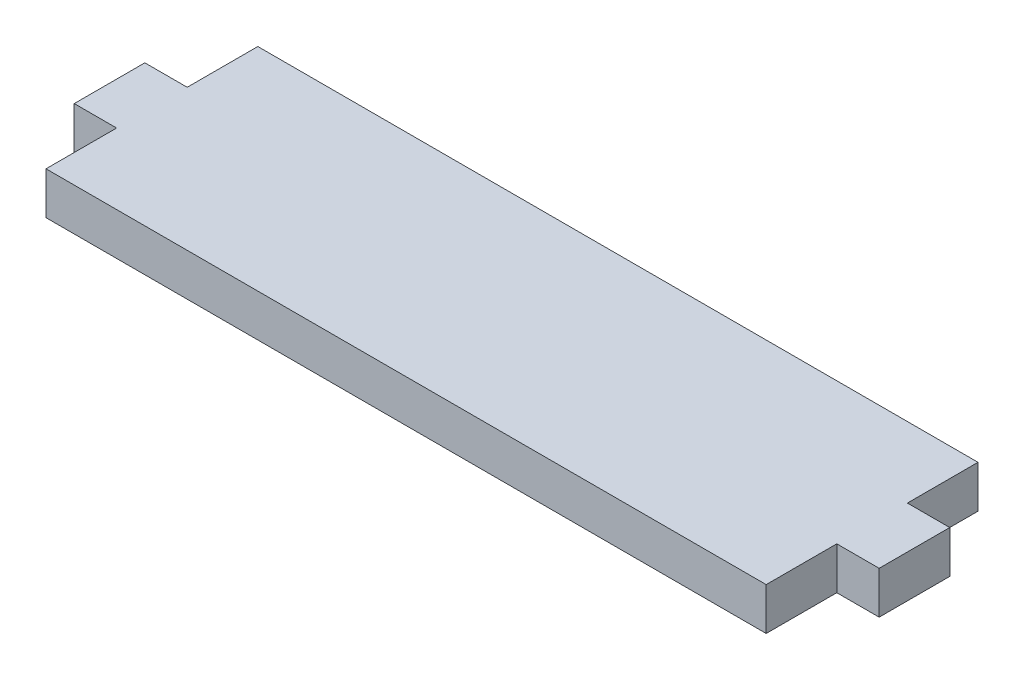
ISO-10303-21;
HEADER;
FILE_DESCRIPTION(('STEP AP214'),'2;1');
FILE_NAME('part.step','',(''),(''),'','','');
FILE_SCHEMA(('AUTOMOTIVE_DESIGN { 1 0 10303 214 1 1 1 1 }'));
ENDSEC;
DATA;
#1=APPLICATION_CONTEXT('core data for automotive mechanical design processes');
#2=APPLICATION_PROTOCOL_DEFINITION('international standard','automotive_design',2000,#1);
#3=PRODUCT_CONTEXT('',#1,'mechanical');
#4=PRODUCT('Part','Part','',(#3));
#5=PRODUCT_RELATED_PRODUCT_CATEGORY('part','',(#4));
#6=PRODUCT_DEFINITION_FORMATION('','',#4);
#7=PRODUCT_DEFINITION_CONTEXT('part definition',#1,'design');
#8=PRODUCT_DEFINITION('design','',#6,#7);
#9=PRODUCT_DEFINITION_SHAPE('','',#8);
#10=(LENGTH_UNIT() NAMED_UNIT(*) SI_UNIT(.MILLI.,.METRE.));
#11=(NAMED_UNIT(*) PLANE_ANGLE_UNIT() SI_UNIT($,.RADIAN.));
#12=(NAMED_UNIT(*) SI_UNIT($,.STERADIAN.) SOLID_ANGLE_UNIT());
#13=UNCERTAINTY_MEASURE_WITH_UNIT(LENGTH_MEASURE(1.E-05),#10,'distance_accuracy_value','');
#14=(GEOMETRIC_REPRESENTATION_CONTEXT(3) GLOBAL_UNCERTAINTY_ASSIGNED_CONTEXT((#13)) GLOBAL_UNIT_ASSIGNED_CONTEXT((#10,
#11,#12)) REPRESENTATION_CONTEXT('',''));
#15=CARTESIAN_POINT('',(0.,0.,0.));
#16=DIRECTION('',(0.,0.,1.));
#17=DIRECTION('',(1.,0.,0.));
#18=AXIS2_PLACEMENT_3D('',#15,#16,#17);
#19=CARTESIAN_POINT('',(-60.,6.,-5.));
#20=DIRECTION('',(1.,0.,0.));
#21=DIRECTION('',(0.,0.,-1.));
#22=AXIS2_PLACEMENT_3D('',#19,#20,#21);
#23=PLANE('',#22);
#24=DIRECTION('',(0.,0.,1.));
#25=VECTOR('',#24,1.);
#26=CARTESIAN_POINT('',(-60.,0.,-5.));
#27=LINE('',#26,#25);
#28=CARTESIAN_POINT('',(-60.,0.,-5.));
#29=VERTEX_POINT('',#28);
#30=CARTESIAN_POINT('',(-60.,0.,5.));
#31=VERTEX_POINT('',#30);
#32=EDGE_CURVE('E155',#29,#31,#27,.T.);
#33=ORIENTED_EDGE('',*,*,#32,.T.);
#34=DIRECTION('',(0.,-1.,0.));
#35=VECTOR('',#34,1.);
#36=CARTESIAN_POINT('',(-60.,6.,5.));
#37=LINE('',#36,#35);
#38=CARTESIAN_POINT('',(-60.,6.,5.));
#39=VERTEX_POINT('',#38);
#40=EDGE_CURVE('E11',#39,#31,#37,.T.);
#41=ORIENTED_EDGE('',*,*,#40,.F.);
#42=DIRECTION('',(0.,0.,1.));
#43=VECTOR('',#42,1.);
#44=CARTESIAN_POINT('',(-60.,6.,-5.));
#45=LINE('',#44,#43);
#46=CARTESIAN_POINT('',(-60.,6.,-5.));
#47=VERTEX_POINT('',#46);
#48=EDGE_CURVE('E177',#47,#39,#45,.T.);
#49=ORIENTED_EDGE('',*,*,#48,.F.);
#50=DIRECTION('',(0.,-1.,0.));
#51=VECTOR('',#50,1.);
#52=CARTESIAN_POINT('',(-60.,6.,-5.));
#53=LINE('',#52,#51);
#54=EDGE_CURVE('E151',#47,#29,#53,.T.);
#55=ORIENTED_EDGE('',*,*,#54,.T.);
#56=EDGE_LOOP('',(#33,#41,#49,#55));
#57=FACE_BOUND('',#56,.T.);
#58=ADVANCED_FACE('F35',(#57),#23,.F.);
#59=CARTESIAN_POINT('',(-60.,6.,5.));
#60=DIRECTION('',(0.,0.,-1.));
#61=DIRECTION('',(-1.,0.,0.));
#62=AXIS2_PLACEMENT_3D('',#59,#60,#61);
#63=PLANE('',#62);
#64=DIRECTION('',(1.,0.,0.));
#65=VECTOR('',#64,1.);
#66=CARTESIAN_POINT('',(-60.,0.,5.));
#67=LINE('',#66,#65);
#68=CARTESIAN_POINT('',(-54.,0.,5.));
#69=VERTEX_POINT('',#68);
#70=EDGE_CURVE('E158',#31,#69,#67,.T.);
#71=ORIENTED_EDGE('',*,*,#70,.T.);
#72=DIRECTION('',(0.,-1.,0.));
#73=VECTOR('',#72,1.);
#74=CARTESIAN_POINT('',(-54.,6.,5.));
#75=LINE('',#74,#73);
#76=CARTESIAN_POINT('',(-54.,6.,5.));
#77=VERTEX_POINT('',#76);
#78=EDGE_CURVE('E43',#77,#69,#75,.T.);
#79=ORIENTED_EDGE('',*,*,#78,.F.);
#80=DIRECTION('',(1.,0.,0.));
#81=VECTOR('',#80,1.);
#82=CARTESIAN_POINT('',(-60.,6.,5.));
#83=LINE('',#82,#81);
#84=EDGE_CURVE('E106',#39,#77,#83,.T.);
#85=ORIENTED_EDGE('',*,*,#84,.F.);
#86=ORIENTED_EDGE('',*,*,#40,.T.);
#87=EDGE_LOOP('',(#71,#79,#85,#86));
#88=FACE_BOUND('',#87,.T.);
#89=ADVANCED_FACE('F255',(#88),#63,.F.);
#90=CARTESIAN_POINT('',(-54.,6.,5.));
#91=DIRECTION('',(1.,0.,0.));
#92=DIRECTION('',(0.,0.,-1.));
#93=AXIS2_PLACEMENT_3D('',#90,#91,#92);
#94=PLANE('',#93);
#95=DIRECTION('',(0.,0.,1.));
#96=VECTOR('',#95,1.);
#97=CARTESIAN_POINT('',(-54.,0.,5.));
#98=LINE('',#97,#96);
#99=CARTESIAN_POINT('',(-54.,0.,15.));
#100=VERTEX_POINT('',#99);
#101=EDGE_CURVE('E160',#69,#100,#98,.T.);
#102=ORIENTED_EDGE('',*,*,#101,.T.);
#103=DIRECTION('',(0.,-1.,0.));
#104=VECTOR('',#103,1.);
#105=CARTESIAN_POINT('',(-54.,6.,15.));
#106=LINE('',#105,#104);
#107=CARTESIAN_POINT('',(-54.,6.,15.));
#108=VERTEX_POINT('',#107);
#109=EDGE_CURVE('E196',#108,#100,#106,.T.);
#110=ORIENTED_EDGE('',*,*,#109,.F.);
#111=DIRECTION('',(0.,0.,1.));
#112=VECTOR('',#111,1.);
#113=CARTESIAN_POINT('',(-54.,6.,5.));
#114=LINE('',#113,#112);
#115=EDGE_CURVE('E204',#77,#108,#114,.T.);
#116=ORIENTED_EDGE('',*,*,#115,.F.);
#117=ORIENTED_EDGE('',*,*,#78,.T.);
#118=EDGE_LOOP('',(#102,#110,#116,#117));
#119=FACE_BOUND('',#118,.T.);
#120=ADVANCED_FACE('F202',(#119),#94,.F.);
#121=CARTESIAN_POINT('',(-54.,6.,15.));
#122=DIRECTION('',(0.,0.,-1.));
#123=DIRECTION('',(-1.,0.,0.));
#124=AXIS2_PLACEMENT_3D('',#121,#122,#123);
#125=PLANE('',#124);
#126=DIRECTION('',(1.,0.,0.));
#127=VECTOR('',#126,1.);
#128=CARTESIAN_POINT('',(-54.,0.,15.));
#129=LINE('',#128,#127);
#130=CARTESIAN_POINT('',(48.,0.,15.));
#131=VERTEX_POINT('',#130);
#132=EDGE_CURVE('E162',#100,#131,#129,.T.);
#133=ORIENTED_EDGE('',*,*,#132,.T.);
#134=DIRECTION('',(0.,-1.,0.));
#135=VECTOR('',#134,1.);
#136=CARTESIAN_POINT('',(48.,6.,15.));
#137=LINE('',#136,#135);
#138=CARTESIAN_POINT('',(48.,6.,15.));
#139=VERTEX_POINT('',#138);
#140=EDGE_CURVE('E193',#139,#131,#137,.T.);
#141=ORIENTED_EDGE('',*,*,#140,.F.);
#142=DIRECTION('',(1.,0.,0.));
#143=VECTOR('',#142,1.);
#144=CARTESIAN_POINT('',(-54.,6.,15.));
#145=LINE('',#144,#143);
#146=EDGE_CURVE('E222',#108,#139,#145,.T.);
#147=ORIENTED_EDGE('',*,*,#146,.F.);
#148=ORIENTED_EDGE('',*,*,#109,.T.);
#149=EDGE_LOOP('',(#133,#141,#147,#148));
#150=FACE_BOUND('',#149,.T.);
#151=ADVANCED_FACE('F213',(#150),#125,.F.);
#152=CARTESIAN_POINT('',(48.,6.,5.));
#153=DIRECTION('',(-1.,0.,0.));
#154=DIRECTION('',(0.,0.,1.));
#155=AXIS2_PLACEMENT_3D('',#152,#153,#154);
#156=PLANE('',#155);
#157=DIRECTION('',(0.,0.,-1.));
#158=VECTOR('',#157,1.);
#159=CARTESIAN_POINT('',(48.,0.,5.));
#160=LINE('',#159,#158);
#161=CARTESIAN_POINT('',(48.,0.,5.));
#162=VERTEX_POINT('',#161);
#163=EDGE_CURVE('E164',#131,#162,#160,.T.);
#164=ORIENTED_EDGE('',*,*,#163,.T.);
#165=DIRECTION('',(0.,-1.,0.));
#166=VECTOR('',#165,1.);
#167=CARTESIAN_POINT('',(48.,6.,5.));
#168=LINE('',#167,#166);
#169=CARTESIAN_POINT('',(48.,6.,5.));
#170=VERTEX_POINT('',#169);
#171=EDGE_CURVE('E190',#170,#162,#168,.T.);
#172=ORIENTED_EDGE('',*,*,#171,.F.);
#173=DIRECTION('',(0.,0.,-1.));
#174=VECTOR('',#173,1.);
#175=CARTESIAN_POINT('',(48.,6.,5.));
#176=LINE('',#175,#174);
#177=EDGE_CURVE('E219',#139,#170,#176,.T.);
#178=ORIENTED_EDGE('',*,*,#177,.F.);
#179=ORIENTED_EDGE('',*,*,#140,.T.);
#180=EDGE_LOOP('',(#164,#172,#178,#179));
#181=FACE_BOUND('',#180,.T.);
#182=ADVANCED_FACE('F217',(#181),#156,.F.);
#183=CARTESIAN_POINT('',(54.,6.,5.));
#184=DIRECTION('',(0.,0.,-1.));
#185=DIRECTION('',(-1.,0.,0.));
#186=AXIS2_PLACEMENT_3D('',#183,#184,#185);
#187=PLANE('',#186);
#188=DIRECTION('',(1.,0.,0.));
#189=VECTOR('',#188,1.);
#190=CARTESIAN_POINT('',(54.,0.,5.));
#191=LINE('',#190,#189);
#192=CARTESIAN_POINT('',(54.,0.,5.));
#193=VERTEX_POINT('',#192);
#194=EDGE_CURVE('E166',#162,#193,#191,.T.);
#195=ORIENTED_EDGE('',*,*,#194,.T.);
#196=DIRECTION('',(0.,-1.,0.));
#197=VECTOR('',#196,1.);
#198=CARTESIAN_POINT('',(54.,6.,5.));
#199=LINE('',#198,#197);
#200=CARTESIAN_POINT('',(54.,6.,5.));
#201=VERTEX_POINT('',#200);
#202=EDGE_CURVE('E187',#201,#193,#199,.T.);
#203=ORIENTED_EDGE('',*,*,#202,.F.);
#204=DIRECTION('',(1.,0.,0.));
#205=VECTOR('',#204,1.);
#206=CARTESIAN_POINT('',(54.,6.,5.));
#207=LINE('',#206,#205);
#208=EDGE_CURVE('E221',#170,#201,#207,.T.);
#209=ORIENTED_EDGE('',*,*,#208,.F.);
#210=ORIENTED_EDGE('',*,*,#171,.T.);
#211=EDGE_LOOP('',(#195,#203,#209,#210));
#212=FACE_BOUND('',#211,.T.);
#213=ADVANCED_FACE('F268',(#212),#187,.F.);
#214=CARTESIAN_POINT('',(54.,6.,-5.));
#215=DIRECTION('',(-1.,0.,0.));
#216=DIRECTION('',(0.,0.,1.));
#217=AXIS2_PLACEMENT_3D('',#214,#215,#216);
#218=PLANE('',#217);
#219=DIRECTION('',(0.,0.,-1.));
#220=VECTOR('',#219,1.);
#221=CARTESIAN_POINT('',(54.,0.,-5.));
#222=LINE('',#221,#220);
#223=CARTESIAN_POINT('',(54.,0.,-5.));
#224=VERTEX_POINT('',#223);
#225=EDGE_CURVE('E168',#193,#224,#222,.T.);
#226=ORIENTED_EDGE('',*,*,#225,.T.);
#227=DIRECTION('',(0.,-1.,0.));
#228=VECTOR('',#227,1.);
#229=CARTESIAN_POINT('',(54.,6.,-5.));
#230=LINE('',#229,#228);
#231=CARTESIAN_POINT('',(54.,6.,-5.));
#232=VERTEX_POINT('',#231);
#233=EDGE_CURVE('E184',#232,#224,#230,.T.);
#234=ORIENTED_EDGE('',*,*,#233,.F.);
#235=DIRECTION('',(0.,0.,-1.));
#236=VECTOR('',#235,1.);
#237=CARTESIAN_POINT('',(54.,6.,-5.));
#238=LINE('',#237,#236);
#239=EDGE_CURVE('E224',#201,#232,#238,.T.);
#240=ORIENTED_EDGE('',*,*,#239,.F.);
#241=ORIENTED_EDGE('',*,*,#202,.T.);
#242=EDGE_LOOP('',(#226,#234,#240,#241));
#243=FACE_BOUND('',#242,.T.);
#244=ADVANCED_FACE('F271',(#243),#218,.F.);
#245=CARTESIAN_POINT('',(54.,6.,-5.));
#246=DIRECTION('',(0.,0.,1.));
#247=DIRECTION('',(1.,0.,0.));
#248=AXIS2_PLACEMENT_3D('',#245,#246,#247);
#249=PLANE('',#248);
#250=DIRECTION('',(-1.,0.,0.));
#251=VECTOR('',#250,1.);
#252=CARTESIAN_POINT('',(54.,0.,-5.));
#253=LINE('',#252,#251);
#254=CARTESIAN_POINT('',(48.,0.,-5.));
#255=VERTEX_POINT('',#254);
#256=EDGE_CURVE('E170',#224,#255,#253,.T.);
#257=ORIENTED_EDGE('',*,*,#256,.T.);
#258=DIRECTION('',(0.,-1.,0.));
#259=VECTOR('',#258,1.);
#260=CARTESIAN_POINT('',(48.,6.,-5.));
#261=LINE('',#260,#259);
#262=CARTESIAN_POINT('',(48.,6.,-5.));
#263=VERTEX_POINT('',#262);
#264=EDGE_CURVE('E181',#263,#255,#261,.T.);
#265=ORIENTED_EDGE('',*,*,#264,.F.);
#266=DIRECTION('',(-1.,0.,0.));
#267=VECTOR('',#266,1.);
#268=CARTESIAN_POINT('',(54.,6.,-5.));
#269=LINE('',#268,#267);
#270=EDGE_CURVE('E230',#232,#263,#269,.T.);
#271=ORIENTED_EDGE('',*,*,#270,.F.);
#272=ORIENTED_EDGE('',*,*,#233,.T.);
#273=EDGE_LOOP('',(#257,#265,#271,#272));
#274=FACE_BOUND('',#273,.T.);
#275=ADVANCED_FACE('F236',(#274),#249,.F.);
#276=CARTESIAN_POINT('',(48.,6.,-5.));
#277=DIRECTION('',(-1.,0.,0.));
#278=DIRECTION('',(0.,0.,1.));
#279=AXIS2_PLACEMENT_3D('',#276,#277,#278);
#280=PLANE('',#279);
#281=DIRECTION('',(0.,0.,-1.));
#282=VECTOR('',#281,1.);
#283=CARTESIAN_POINT('',(48.,0.,-5.));
#284=LINE('',#283,#282);
#285=CARTESIAN_POINT('',(48.,0.,-15.));
#286=VERTEX_POINT('',#285);
#287=EDGE_CURVE('E172',#255,#286,#284,.T.);
#288=ORIENTED_EDGE('',*,*,#287,.T.);
#289=DIRECTION('',(0.,-1.,0.));
#290=VECTOR('',#289,1.);
#291=CARTESIAN_POINT('',(48.,6.,-15.));
#292=LINE('',#291,#290);
#293=CARTESIAN_POINT('',(48.,6.,-15.));
#294=VERTEX_POINT('',#293);
#295=EDGE_CURVE('E146',#294,#286,#292,.T.);
#296=ORIENTED_EDGE('',*,*,#295,.F.);
#297=DIRECTION('',(0.,0.,-1.));
#298=VECTOR('',#297,1.);
#299=CARTESIAN_POINT('',(48.,6.,-5.));
#300=LINE('',#299,#298);
#301=EDGE_CURVE('E137',#263,#294,#300,.T.);
#302=ORIENTED_EDGE('',*,*,#301,.F.);
#303=ORIENTED_EDGE('',*,*,#264,.T.);
#304=EDGE_LOOP('',(#288,#296,#302,#303));
#305=FACE_BOUND('',#304,.T.);
#306=ADVANCED_FACE('F240',(#305),#280,.F.);
#307=CARTESIAN_POINT('',(-54.,6.,-15.));
#308=DIRECTION('',(0.,0.,1.));
#309=DIRECTION('',(1.,0.,0.));
#310=AXIS2_PLACEMENT_3D('',#307,#308,#309);
#311=PLANE('',#310);
#312=DIRECTION('',(-1.,0.,0.));
#313=VECTOR('',#312,1.);
#314=CARTESIAN_POINT('',(-54.,0.,-15.));
#315=LINE('',#314,#313);
#316=CARTESIAN_POINT('',(-54.,0.,-15.));
#317=VERTEX_POINT('',#316);
#318=EDGE_CURVE('E145',#286,#317,#315,.T.);
#319=ORIENTED_EDGE('',*,*,#318,.T.);
#320=DIRECTION('',(0.,-1.,0.));
#321=VECTOR('',#320,1.);
#322=CARTESIAN_POINT('',(-54.,6.,-15.));
#323=LINE('',#322,#321);
#324=CARTESIAN_POINT('',(-54.,6.,-15.));
#325=VERTEX_POINT('',#324);
#326=EDGE_CURVE('E142',#325,#317,#323,.T.);
#327=ORIENTED_EDGE('',*,*,#326,.F.);
#328=DIRECTION('',(-1.,0.,0.));
#329=VECTOR('',#328,1.);
#330=CARTESIAN_POINT('',(-54.,6.,-15.));
#331=LINE('',#330,#329);
#332=EDGE_CURVE('E131',#294,#325,#331,.T.);
#333=ORIENTED_EDGE('',*,*,#332,.F.);
#334=ORIENTED_EDGE('',*,*,#295,.T.);
#335=EDGE_LOOP('',(#319,#327,#333,#334));
#336=FACE_BOUND('',#335,.T.);
#337=ADVANCED_FACE('F143',(#336),#311,.F.);
#338=CARTESIAN_POINT('',(-54.,6.,-5.));
#339=DIRECTION('',(1.,0.,0.));
#340=DIRECTION('',(0.,0.,-1.));
#341=AXIS2_PLACEMENT_3D('',#338,#339,#340);
#342=PLANE('',#341);
#343=DIRECTION('',(0.,0.,1.));
#344=VECTOR('',#343,1.);
#345=CARTESIAN_POINT('',(-54.,0.,-5.));
#346=LINE('',#345,#344);
#347=CARTESIAN_POINT('',(-54.,0.,-5.));
#348=VERTEX_POINT('',#347);
#349=EDGE_CURVE('E92',#317,#348,#346,.T.);
#350=ORIENTED_EDGE('',*,*,#349,.T.);
#351=DIRECTION('',(0.,-1.,0.));
#352=VECTOR('',#351,1.);
#353=CARTESIAN_POINT('',(-54.,6.,-5.));
#354=LINE('',#353,#352);
#355=CARTESIAN_POINT('',(-54.,6.,-5.));
#356=VERTEX_POINT('',#355);
#357=EDGE_CURVE('E147',#356,#348,#354,.T.);
#358=ORIENTED_EDGE('',*,*,#357,.F.);
#359=DIRECTION('',(0.,0.,1.));
#360=VECTOR('',#359,1.);
#361=CARTESIAN_POINT('',(-54.,6.,-5.));
#362=LINE('',#361,#360);
#363=EDGE_CURVE('E135',#325,#356,#362,.T.);
#364=ORIENTED_EDGE('',*,*,#363,.F.);
#365=ORIENTED_EDGE('',*,*,#326,.T.);
#366=EDGE_LOOP('',(#350,#358,#364,#365));
#367=FACE_BOUND('',#366,.T.);
#368=ADVANCED_FACE('F149',(#367),#342,.F.);
#369=CARTESIAN_POINT('',(-60.,6.,-5.));
#370=DIRECTION('',(0.,0.,1.));
#371=DIRECTION('',(1.,0.,0.));
#372=AXIS2_PLACEMENT_3D('',#369,#370,#371);
#373=PLANE('',#372);
#374=DIRECTION('',(-1.,0.,0.));
#375=VECTOR('',#374,1.);
#376=CARTESIAN_POINT('',(-60.,0.,-5.));
#377=LINE('',#376,#375);
#378=EDGE_CURVE('E98',#348,#29,#377,.T.);
#379=ORIENTED_EDGE('',*,*,#378,.T.);
#380=ORIENTED_EDGE('',*,*,#54,.F.);
#381=DIRECTION('',(-1.,0.,0.));
#382=VECTOR('',#381,1.);
#383=CARTESIAN_POINT('',(-60.,6.,-5.));
#384=LINE('',#383,#382);
#385=EDGE_CURVE('E51',#356,#47,#384,.T.);
#386=ORIENTED_EDGE('',*,*,#385,.F.);
#387=ORIENTED_EDGE('',*,*,#357,.T.);
#388=EDGE_LOOP('',(#379,#380,#386,#387));
#389=FACE_BOUND('',#388,.T.);
#390=ADVANCED_FACE('F244',(#389),#373,.F.);
#391=CARTESIAN_POINT('',(0.,6.,0.));
#392=DIRECTION('',(0.,1.,0.));
#393=DIRECTION('',(0.,0.,1.));
#394=AXIS2_PLACEMENT_3D('',#391,#392,#393);
#395=PLANE('',#394);
#396=ORIENTED_EDGE('',*,*,#48,.T.);
#397=ORIENTED_EDGE('',*,*,#84,.T.);
#398=ORIENTED_EDGE('',*,*,#115,.T.);
#399=ORIENTED_EDGE('',*,*,#146,.T.);
#400=ORIENTED_EDGE('',*,*,#177,.T.);
#401=ORIENTED_EDGE('',*,*,#208,.T.);
#402=ORIENTED_EDGE('',*,*,#239,.T.);
#403=ORIENTED_EDGE('',*,*,#270,.T.);
#404=ORIENTED_EDGE('',*,*,#301,.T.);
#405=ORIENTED_EDGE('',*,*,#332,.T.);
#406=ORIENTED_EDGE('',*,*,#363,.T.);
#407=ORIENTED_EDGE('',*,*,#385,.T.);
#408=EDGE_LOOP('',(#396,#397,#398,#399,#400,#401,#402,#403,#404,#405,#406,#407));
#409=FACE_BOUND('',#408,.T.);
#410=ADVANCED_FACE('F133',(#409),#395,.T.);
#411=CARTESIAN_POINT('',(0.,0.,0.));
#412=DIRECTION('',(0.,1.,0.));
#413=DIRECTION('',(0.,0.,1.));
#414=AXIS2_PLACEMENT_3D('',#411,#412,#413);
#415=PLANE('',#414);
#416=ORIENTED_EDGE('',*,*,#32,.F.);
#417=ORIENTED_EDGE('',*,*,#378,.F.);
#418=ORIENTED_EDGE('',*,*,#349,.F.);
#419=ORIENTED_EDGE('',*,*,#318,.F.);
#420=ORIENTED_EDGE('',*,*,#287,.F.);
#421=ORIENTED_EDGE('',*,*,#256,.F.);
#422=ORIENTED_EDGE('',*,*,#225,.F.);
#423=ORIENTED_EDGE('',*,*,#194,.F.);
#424=ORIENTED_EDGE('',*,*,#163,.F.);
#425=ORIENTED_EDGE('',*,*,#132,.F.);
#426=ORIENTED_EDGE('',*,*,#101,.F.);
#427=ORIENTED_EDGE('',*,*,#70,.F.);
#428=EDGE_LOOP('',(#416,#417,#418,#419,#420,#421,#422,#423,#424,#425,#426,#427));
#429=FACE_BOUND('',#428,.T.);
#430=ADVANCED_FACE('F208',(#429),#415,.F.);
#431=CLOSED_SHELL('',(#58,#89,#120,#151,#182,#213,#244,#275,#306,#337,#368,#390,#410,#430));
#432=MANIFOLD_SOLID_BREP('B2',#431);
#433=ADVANCED_BREP_SHAPE_REPRESENTATION('',(#18,#432),#14);
#434=SHAPE_DEFINITION_REPRESENTATION(#9,#433);
ENDSEC;
END-ISO-10303-21;
